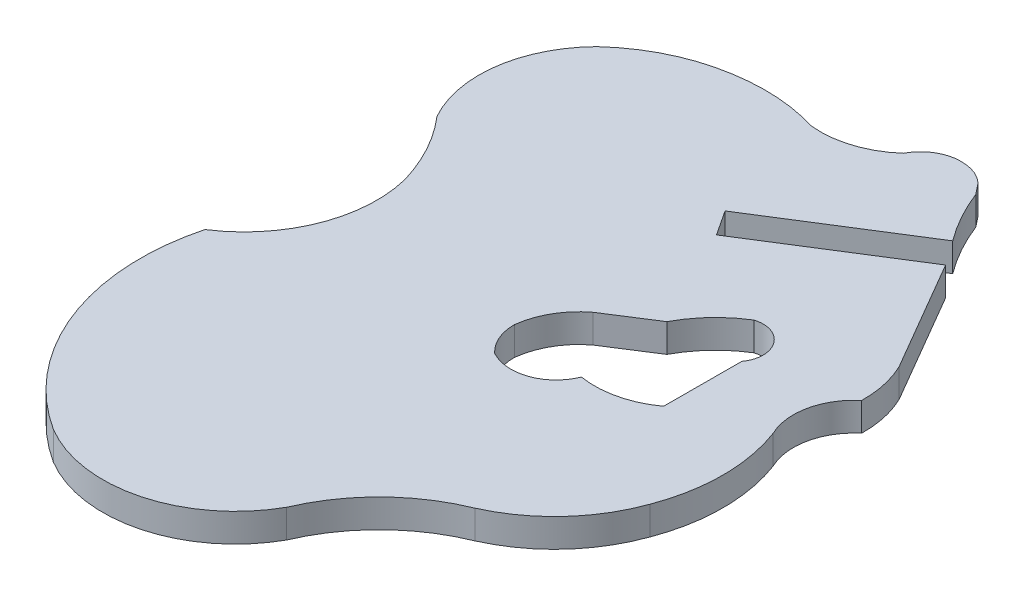
ISO-10303-21;
HEADER;
FILE_DESCRIPTION(('STEP AP214'),'2;1');
FILE_NAME('part.step','',(''),(''),'','','');
FILE_SCHEMA(('AUTOMOTIVE_DESIGN { 1 0 10303 214 1 1 1 1 }'));
ENDSEC;
DATA;
#1=APPLICATION_CONTEXT('core data for automotive mechanical design processes');
#2=APPLICATION_PROTOCOL_DEFINITION('international standard','automotive_design',2000,#1);
#3=PRODUCT_CONTEXT('',#1,'mechanical');
#4=PRODUCT('Part','Part','',(#3));
#5=PRODUCT_RELATED_PRODUCT_CATEGORY('part','',(#4));
#6=PRODUCT_DEFINITION_FORMATION('','',#4);
#7=PRODUCT_DEFINITION_CONTEXT('part definition',#1,'design');
#8=PRODUCT_DEFINITION('design','',#6,#7);
#9=PRODUCT_DEFINITION_SHAPE('','',#8);
#10=(LENGTH_UNIT() NAMED_UNIT(*) SI_UNIT(.MILLI.,.METRE.));
#11=(NAMED_UNIT(*) PLANE_ANGLE_UNIT() SI_UNIT($,.RADIAN.));
#12=(NAMED_UNIT(*) SI_UNIT($,.STERADIAN.) SOLID_ANGLE_UNIT());
#13=UNCERTAINTY_MEASURE_WITH_UNIT(LENGTH_MEASURE(1.E-05),#10,'distance_accuracy_value','');
#14=(GEOMETRIC_REPRESENTATION_CONTEXT(3) GLOBAL_UNCERTAINTY_ASSIGNED_CONTEXT((#13)) GLOBAL_UNIT_ASSIGNED_CONTEXT((#10,
#11,#12)) REPRESENTATION_CONTEXT('',''));
#15=CARTESIAN_POINT('',(0.,0.,0.));
#16=DIRECTION('',(0.,0.,1.));
#17=DIRECTION('',(1.,0.,0.));
#18=AXIS2_PLACEMENT_3D('',#15,#16,#17);
#19=CARTESIAN_POINT('',(-177.073040595718,3.,-146.607961074093));
#20=DIRECTION('',(0.,1.,0.));
#21=DIRECTION('',(0.,0.,1.));
#22=AXIS2_PLACEMENT_3D('',#19,#20,#21);
#23=PLANE('',#22);
#24=CARTESIAN_POINT('',(-177.073040595718,3.,-146.607961074093));
#25=DIRECTION('',(0.,-1.,0.));
#26=DIRECTION('',(0.,0.,1.));
#27=AXIS2_PLACEMENT_3D('',#24,#25,#26);
#28=CIRCLE('',#27,23.2847574819);
#29=CARTESIAN_POINT('',(-195.734879999937,3.,-132.682600000064));
#30=VERTEX_POINT('',#29);
#31=CARTESIAN_POINT('',(-198.767980000004,3.,-138.151629999963));
#32=VERTEX_POINT('',#31);
#33=EDGE_CURVE('E297',#30,#32,#28,.T.);
#34=ORIENTED_EDGE('',*,*,#33,.T.);
#35=DIRECTION('',(-0.620096836389196,0.,-0.784525279070159));
#36=VECTOR('',#35,1.);
#37=CARTESIAN_POINT('',(-199.646109999993,3.,-139.262609999979));
#38=LINE('',#37,#36);
#39=CARTESIAN_POINT('',(-199.646109999993,3.,-139.262609999979));
#40=VERTEX_POINT('',#39);
#41=EDGE_CURVE('E300',#32,#40,#38,.T.);
#42=ORIENTED_EDGE('',*,*,#41,.T.);
#43=CARTESIAN_POINT('',(-202.415735567504,3.,-136.382802406763));
#44=DIRECTION('',(0.,1.,0.));
#45=DIRECTION('',(0.,0.,1.));
#46=AXIS2_PLACEMENT_3D('',#43,#44,#45);
#47=CIRCLE('',#46,3.99551217719999);
#48=CARTESIAN_POINT('',(-202.215419999981,3.,-140.373289999973));
#49=VERTEX_POINT('',#48);
#50=EDGE_CURVE('E303',#40,#49,#47,.T.);
#51=ORIENTED_EDGE('',*,*,#50,.T.);
#52=CARTESIAN_POINT('',(-202.581688652702,3.,-136.164800742078));
#53=DIRECTION('',(0.,1.,0.));
#54=DIRECTION('',(0.,0.,1.));
#55=AXIS2_PLACEMENT_3D('',#52,#53,#54);
#56=CIRCLE('',#55,4.22439753808548);
#57=CARTESIAN_POINT('',(-206.33445,3.,-138.104469999969));
#58=VERTEX_POINT('',#57);
#59=EDGE_CURVE('E305',#49,#58,#56,.T.);
#60=ORIENTED_EDGE('',*,*,#59,.T.);
#61=CARTESIAN_POINT('',(-212.716165418054,3.,-145.258051477838));
#62=DIRECTION('',(0.,-1.,0.));
#63=DIRECTION('',(0.,0.,1.));
#64=AXIS2_PLACEMENT_3D('',#61,#62,#63);
#65=CIRCLE('',#64,9.58644979319999);
#66=CARTESIAN_POINT('',(-213.715389999984,3.,-135.723820000031));
#67=VERTEX_POINT('',#66);
#68=EDGE_CURVE('E307',#58,#67,#65,.T.);
#69=ORIENTED_EDGE('',*,*,#68,.T.);
#70=CARTESIAN_POINT('',(-219.399632120715,3.,-117.047120137484));
#71=DIRECTION('',(0.,1.,0.));
#72=DIRECTION('',(0.,0.,1.));
#73=AXIS2_PLACEMENT_3D('',#70,#71,#72);
#74=CIRCLE('',#73,19.5225440515);
#75=CARTESIAN_POINT('',(-222.625389999992,3.,-136.301320000035));
#76=VERTEX_POINT('',#75);
#77=EDGE_CURVE('E309',#67,#76,#74,.T.);
#78=ORIENTED_EDGE('',*,*,#77,.T.);
#79=CARTESIAN_POINT('',(-219.850682948534,3.,-118.149883391559));
#80=DIRECTION('',(0.,1.,0.));
#81=DIRECTION('',(0.,0.,1.));
#82=AXIS2_PLACEMENT_3D('',#79,#80,#81);
#83=CIRCLE('',#82,18.3622888054);
#84=CARTESIAN_POINT('',(-232.298679999996,3.,-131.648809999986));
#85=VERTEX_POINT('',#84);
#86=EDGE_CURVE('E311',#76,#85,#83,.T.);
#87=ORIENTED_EDGE('',*,*,#86,.T.);
#88=CARTESIAN_POINT('',(-223.186654043018,3.,-122.726242323869));
#89=DIRECTION('',(0.,1.,0.));
#90=DIRECTION('',(0.,0.,1.));
#91=AXIS2_PLACEMENT_3D('',#88,#89,#90);
#92=CIRCLE('',#91,12.7530871155);
#93=CARTESIAN_POINT('',(-235.698870000031,3.,-125.193159999958));
#94=VERTEX_POINT('',#93);
#95=EDGE_CURVE('E313',#85,#94,#92,.T.);
#96=ORIENTED_EDGE('',*,*,#95,.T.);
#97=CARTESIAN_POINT('',(-223.610760955848,3.,-122.848935955944));
#98=DIRECTION('',(0.,1.,0.));
#99=DIRECTION('',(0.,0.,1.));
#100=AXIS2_PLACEMENT_3D('',#97,#98,#99);
#101=CIRCLE('',#100,12.3133166382012);
#102=CARTESIAN_POINT('',(-234.358339999996,3.,-116.840000000021));
#103=VERTEX_POINT('',#102);
#104=EDGE_CURVE('E315',#94,#103,#101,.T.);
#105=ORIENTED_EDGE('',*,*,#104,.T.);
#106=CARTESIAN_POINT('',(-249.626203652665,3.,-103.633186687729));
#107=DIRECTION('',(0.,-1.,0.));
#108=DIRECTION('',(0.,0.,1.));
#109=AXIS2_PLACEMENT_3D('',#106,#107,#108);
#110=CIRCLE('',#109,20.187312312);
#111=CARTESIAN_POINT('',(-230.262679999968,3.,-109.341210000019));
#112=VERTEX_POINT('',#111);
#113=EDGE_CURVE('E317',#103,#112,#110,.T.);
#114=ORIENTED_EDGE('',*,*,#113,.T.);
#115=CARTESIAN_POINT('',(-243.851217543204,3.,-105.987826193848));
#116=DIRECTION('',(0.,-1.,0.));
#117=DIRECTION('',(0.,0.,1.));
#118=AXIS2_PLACEMENT_3D('',#115,#116,#117);
#119=CIRCLE('',#118,13.9961971805);
#120=CARTESIAN_POINT('',(-236.255709999962,3.,-94.2318999999662));
#121=VERTEX_POINT('',#120);
#122=EDGE_CURVE('E319',#112,#121,#119,.T.);
#123=ORIENTED_EDGE('',*,*,#122,.T.);
#124=CARTESIAN_POINT('',(-213.008919949913,3.,-88.1720898716844));
#125=DIRECTION('',(0.,1.,0.));
#126=DIRECTION('',(0.,0.,1.));
#127=AXIS2_PLACEMENT_3D('',#124,#125,#126);
#128=CIRCLE('',#127,24.0236247561);
#129=CARTESIAN_POINT('',(-226.005049999981,3.,-67.9672600000025));
#130=VERTEX_POINT('',#129);
#131=EDGE_CURVE('E321',#121,#130,#128,.T.);
#132=ORIENTED_EDGE('',*,*,#131,.T.);
#133=CARTESIAN_POINT('',(-218.776987319861,3.,-79.9559307137779));
#134=DIRECTION('',(0.,1.,0.));
#135=DIRECTION('',(0.,0.,1.));
#136=AXIS2_PLACEMENT_3D('',#133,#134,#135);
#137=CIRCLE('',#136,13.9990398096116);
#138=CARTESIAN_POINT('',(-206.543770000024,3.,-73.1499399999477));
#139=VERTEX_POINT('',#138);
#140=EDGE_CURVE('E323',#130,#139,#137,.T.);
#141=ORIENTED_EDGE('',*,*,#140,.T.);
#142=CARTESIAN_POINT('',(-189.569126865505,3.,-65.9186332455275));
#143=DIRECTION('',(0.,-1.,0.));
#144=DIRECTION('',(0.,0.,1.));
#145=AXIS2_PLACEMENT_3D('',#142,#143,#144);
#146=CIRCLE('',#145,18.4507535597);
#147=CARTESIAN_POINT('',(-196.522790000002,3.,-83.0088899999687));
#148=VERTEX_POINT('',#147);
#149=EDGE_CURVE('E325',#139,#148,#146,.T.);
#150=ORIENTED_EDGE('',*,*,#149,.T.);
#151=CARTESIAN_POINT('',(-203.328855747617,3.,-98.2206837893));
#152=DIRECTION('',(0.,1.,0.));
#153=DIRECTION('',(0.,0.,1.));
#154=AXIS2_PLACEMENT_3D('',#151,#152,#153);
#155=CIRCLE('',#154,16.6649692844);
#156=CARTESIAN_POINT('',(-187.636320000008,3.,-92.6112699999639));
#157=VERTEX_POINT('',#156);
#158=EDGE_CURVE('E327',#148,#157,#155,.T.);
#159=ORIENTED_EDGE('',*,*,#158,.T.);
#160=CARTESIAN_POINT('',(-204.850439986107,3.,-99.1295587844936));
#161=DIRECTION('',(0.,1.,0.));
#162=DIRECTION('',(0.,0.,1.));
#163=AXIS2_PLACEMENT_3D('',#160,#161,#162);
#164=CIRCLE('',#163,18.4069013028908);
#165=CARTESIAN_POINT('',(-187.615789999981,3.,-105.593370000029));
#166=VERTEX_POINT('',#165);
#167=EDGE_CURVE('E329',#157,#166,#164,.T.);
#168=ORIENTED_EDGE('',*,*,#167,.T.);
#169=CARTESIAN_POINT('',(-181.848418819007,3.,-108.364755441414));
#170=DIRECTION('',(0.,-1.,0.));
#171=DIRECTION('',(0.,0.,1.));
#172=AXIS2_PLACEMENT_3D('',#169,#170,#171);
#173=CIRCLE('',#172,6.39868327110001);
#174=CARTESIAN_POINT('',(-185.947970000007,3.,-113.277679999986));
#175=VERTEX_POINT('',#174);
#176=EDGE_CURVE('E331',#166,#175,#173,.T.);
#177=ORIENTED_EDGE('',*,*,#176,.T.);
#178=CARTESIAN_POINT('',(-197.1378390176,3.,-113.4778555205));
#179=DIRECTION('',(0.,1.,0.));
#180=DIRECTION('',(0.,0.,1.));
#181=AXIS2_PLACEMENT_3D('',#178,#179,#180);
#182=CIRCLE('',#181,11.1916593439);
#183=CARTESIAN_POINT('',(-187.05882000001,3.,-118.342690000003));
#184=VERTEX_POINT('',#183);
#185=EDGE_CURVE('E333',#175,#184,#182,.T.);
#186=ORIENTED_EDGE('',*,*,#185,.T.);
#187=DIRECTION('',(-0.50306954793614,0.,-0.86424593139877));
#188=VECTOR('',#187,1.);
#189=CARTESIAN_POINT('',(-193.90008,3.,-130.0956));
#190=LINE('',#189,#188);
#191=CARTESIAN_POINT('',(-193.90008,3.,-130.0956));
#192=VERTEX_POINT('',#191);
#193=EDGE_CURVE('E335',#184,#192,#190,.T.);
#194=ORIENTED_EDGE('',*,*,#193,.T.);
#195=DIRECTION('',(-0.846419801881814,0.,0.532516214760031));
#196=VECTOR('',#195,1.);
#197=CARTESIAN_POINT('',(-208.75176,3.,-120.75182));
#198=LINE('',#197,#196);
#199=CARTESIAN_POINT('',(-208.75176,3.,-120.75182));
#200=VERTEX_POINT('',#199);
#201=EDGE_CURVE('E337',#192,#200,#198,.T.);
#202=ORIENTED_EDGE('',*,*,#201,.T.);
#203=DIRECTION('',(-0.549969731069871,0.,-0.83518458732602));
#204=VECTOR('',#203,1.);
#205=CARTESIAN_POINT('',(-210.49387,3.,-123.39739));
#206=LINE('',#205,#204);
#207=CARTESIAN_POINT('',(-210.49387,3.,-123.39739));
#208=VERTEX_POINT('',#207);
#209=EDGE_CURVE('E339',#200,#208,#206,.T.);
#210=ORIENTED_EDGE('',*,*,#209,.T.);
#211=DIRECTION('',(0.846426394731718,0.,-0.532505735463447));
#212=VECTOR('',#211,1.);
#213=CARTESIAN_POINT('',(-195.734879999937,3.,-132.682600000064));
#214=LINE('',#213,#212);
#215=EDGE_CURVE('E341',#208,#30,#214,.T.);
#216=ORIENTED_EDGE('',*,*,#215,.T.);
#217=EDGE_LOOP('',(#34,#42,#51,#60,#69,#78,#87,#96,#105,#114,#123,#132,#141,#150,#159,#168,#177,
#186,#194,#202,#210,#216));
#218=FACE_BOUND('',#217,.T.);
#219=CARTESIAN_POINT('',(-207.324159857303,3.,-102.387960050793));
#220=DIRECTION('',(0.,1.,0.));
#221=DIRECTION('',(0.,0.,1.));
#222=AXIS2_PLACEMENT_3D('',#219,#220,#221);
#223=CIRCLE('',#222,4.7764110298);
#224=CARTESIAN_POINT('',(-209.643420000052,3.,-98.2124199999914));
#225=VERTEX_POINT('',#224);
#226=CARTESIAN_POINT('',(-202.887099999982,3.,-100.619739999965));
#227=VERTEX_POINT('',#226);
#228=EDGE_CURVE('E240',#225,#227,#223,.T.);
#229=ORIENTED_EDGE('',*,*,#228,.F.);
#230=CARTESIAN_POINT('',(-206.279949198406,3.,-101.826418136906));
#231=DIRECTION('',(0.,1.,0.));
#232=DIRECTION('',(0.,0.,1.));
#233=AXIS2_PLACEMENT_3D('',#230,#231,#232);
#234=CIRCLE('',#233,4.93699487209999);
#235=CARTESIAN_POINT('',(-211.216760000067,3.,-101.869049999994));
#236=VERTEX_POINT('',#235);
#237=EDGE_CURVE('E232',#236,#225,#234,.T.);
#238=ORIENTED_EDGE('',*,*,#237,.F.);
#239=CARTESIAN_POINT('',(-203.512905561007,3.,-100.976537756439));
#240=DIRECTION('',(0.,1.,0.));
#241=DIRECTION('',(0.,0.,1.));
#242=AXIS2_PLACEMENT_3D('',#239,#240,#241);
#243=CIRCLE('',#242,7.75538208750001);
#244=CARTESIAN_POINT('',(-208.18492,3.,-107.16671));
#245=VERTEX_POINT('',#244);
#246=EDGE_CURVE('E265',#245,#236,#243,.T.);
#247=ORIENTED_EDGE('',*,*,#246,.F.);
#248=DIRECTION('',(-0.842609819054227,0.,0.538524551746159));
#249=VECTOR('',#248,1.);
#250=CARTESIAN_POINT('',(-203.441110000026,3.,-110.198550000004));
#251=LINE('',#250,#249);
#252=CARTESIAN_POINT('',(-203.441110000026,3.,-110.198550000004));
#253=VERTEX_POINT('',#252);
#254=EDGE_CURVE('E263',#253,#245,#251,.T.);
#255=ORIENTED_EDGE('',*,*,#254,.F.);
#256=CARTESIAN_POINT('',(-192.432284118591,3.,-104.344365599818));
#257=DIRECTION('',(0.,1.,0.));
#258=DIRECTION('',(0.,0.,1.));
#259=AXIS2_PLACEMENT_3D('',#256,#257,#258);
#260=CIRCLE('',#259,12.4685894262);
#261=CARTESIAN_POINT('',(-199.000790000004,3.,-114.942500000031));
#262=VERTEX_POINT('',#261);
#263=EDGE_CURVE('E261',#262,#253,#260,.T.);
#264=ORIENTED_EDGE('',*,*,#263,.F.);
#265=CARTESIAN_POINT('',(-198.152149598475,3.,-112.215069436477));
#266=DIRECTION('',(0.,1.,0.));
#267=DIRECTION('',(0.,0.,1.));
#268=AXIS2_PLACEMENT_3D('',#265,#266,#267);
#269=CIRCLE('',#268,2.85640823590001);
#270=CARTESIAN_POINT('',(-195.85097,3.,-110.52284));
#271=VERTEX_POINT('',#270);
#272=EDGE_CURVE('E259',#271,#262,#269,.T.);
#273=ORIENTED_EDGE('',*,*,#272,.F.);
#274=DIRECTION('',(0.00286829144360486,0.,-0.999995886443637));
#275=VECTOR('',#274,1.);
#276=CARTESIAN_POINT('',(-195.874599999969,3.,-102.284520000027));
#277=LINE('',#276,#275);
#278=CARTESIAN_POINT('',(-195.874599999969,3.,-102.284520000027));
#279=VERTEX_POINT('',#278);
#280=EDGE_CURVE('E255',#279,#271,#277,.T.);
#281=ORIENTED_EDGE('',*,*,#280,.F.);
#282=CARTESIAN_POINT('',(-201.38211636918,3.,-109.882000861942));
#283=DIRECTION('',(0.,1.,0.));
#284=DIRECTION('',(0.,0.,1.));
#285=AXIS2_PLACEMENT_3D('',#282,#283,#284);
#286=CIRCLE('',#285,9.38373337239998);
#287=EDGE_CURVE('E253',#227,#279,#286,.T.);
#288=ORIENTED_EDGE('',*,*,#287,.F.);
#289=EDGE_LOOP('',(#229,#238,#247,#255,#264,#273,#281,#288));
#290=FACE_BOUND('',#289,.T.);
#291=ADVANCED_FACE('F35',(#218,#290),#23,.T.);
#292=CARTESIAN_POINT('',(-177.073040595718,0.,-146.607961074093));
#293=DIRECTION('',(0.,1.,0.));
#294=DIRECTION('',(0.,0.,1.));
#295=AXIS2_PLACEMENT_3D('',#292,#293,#294);
#296=PLANE('',#295);
#297=CARTESIAN_POINT('',(-177.073040595718,0.,-146.607961074093));
#298=DIRECTION('',(0.,-1.,0.));
#299=DIRECTION('',(0.,0.,1.));
#300=AXIS2_PLACEMENT_3D('',#297,#298,#299);
#301=CIRCLE('',#300,23.2847574819);
#302=CARTESIAN_POINT('',(-195.734879999937,0.,-132.682600000064));
#303=VERTEX_POINT('',#302);
#304=CARTESIAN_POINT('',(-198.767980000004,0.,-138.151629999963));
#305=VERTEX_POINT('',#304);
#306=EDGE_CURVE('E248',#303,#305,#301,.T.);
#307=ORIENTED_EDGE('',*,*,#306,.F.);
#308=DIRECTION('',(0.846426394731718,0.,-0.532505735463447));
#309=VECTOR('',#308,1.);
#310=CARTESIAN_POINT('',(-195.734879999937,0.,-132.682600000064));
#311=LINE('',#310,#309);
#312=CARTESIAN_POINT('',(-210.49387,0.,-123.39739));
#313=VERTEX_POINT('',#312);
#314=EDGE_CURVE('E301',#313,#303,#311,.T.);
#315=ORIENTED_EDGE('',*,*,#314,.F.);
#316=DIRECTION('',(-0.549969731069871,0.,-0.83518458732602));
#317=VECTOR('',#316,1.);
#318=CARTESIAN_POINT('',(-210.49387,0.,-123.39739));
#319=LINE('',#318,#317);
#320=CARTESIAN_POINT('',(-208.75176,0.,-120.75182));
#321=VERTEX_POINT('',#320);
#322=EDGE_CURVE('E384',#321,#313,#319,.T.);
#323=ORIENTED_EDGE('',*,*,#322,.F.);
#324=DIRECTION('',(-0.846419801881814,0.,0.532516214760031));
#325=VECTOR('',#324,1.);
#326=CARTESIAN_POINT('',(-208.75176,0.,-120.75182));
#327=LINE('',#326,#325);
#328=CARTESIAN_POINT('',(-193.90008,0.,-130.0956));
#329=VERTEX_POINT('',#328);
#330=EDGE_CURVE('E382',#329,#321,#327,.T.);
#331=ORIENTED_EDGE('',*,*,#330,.F.);
#332=DIRECTION('',(-0.50306954793614,0.,-0.86424593139877));
#333=VECTOR('',#332,1.);
#334=CARTESIAN_POINT('',(-193.90008,0.,-130.0956));
#335=LINE('',#334,#333);
#336=CARTESIAN_POINT('',(-187.05882000001,0.,-118.342690000003));
#337=VERTEX_POINT('',#336);
#338=EDGE_CURVE('E380',#337,#329,#335,.T.);
#339=ORIENTED_EDGE('',*,*,#338,.F.);
#340=CARTESIAN_POINT('',(-197.1378390176,0.,-113.4778555205));
#341=DIRECTION('',(0.,1.,0.));
#342=DIRECTION('',(0.,0.,1.));
#343=AXIS2_PLACEMENT_3D('',#340,#341,#342);
#344=CIRCLE('',#343,11.1916593439);
#345=CARTESIAN_POINT('',(-185.947970000007,0.,-113.277679999986));
#346=VERTEX_POINT('',#345);
#347=EDGE_CURVE('E378',#346,#337,#344,.T.);
#348=ORIENTED_EDGE('',*,*,#347,.F.);
#349=CARTESIAN_POINT('',(-181.848418819007,0.,-108.364755441414));
#350=DIRECTION('',(0.,-1.,0.));
#351=DIRECTION('',(0.,0.,1.));
#352=AXIS2_PLACEMENT_3D('',#349,#350,#351);
#353=CIRCLE('',#352,6.39868327110001);
#354=CARTESIAN_POINT('',(-187.615789999981,0.,-105.593370000029));
#355=VERTEX_POINT('',#354);
#356=EDGE_CURVE('E376',#355,#346,#353,.T.);
#357=ORIENTED_EDGE('',*,*,#356,.F.);
#358=CARTESIAN_POINT('',(-204.850439986107,0.,-99.1295587844936));
#359=DIRECTION('',(0.,1.,0.));
#360=DIRECTION('',(0.,0.,1.));
#361=AXIS2_PLACEMENT_3D('',#358,#359,#360);
#362=CIRCLE('',#361,18.4069013028908);
#363=CARTESIAN_POINT('',(-187.636320000008,0.,-92.6112699999639));
#364=VERTEX_POINT('',#363);
#365=EDGE_CURVE('E374',#364,#355,#362,.T.);
#366=ORIENTED_EDGE('',*,*,#365,.F.);
#367=CARTESIAN_POINT('',(-203.328855747617,0.,-98.2206837893));
#368=DIRECTION('',(0.,1.,0.));
#369=DIRECTION('',(0.,0.,1.));
#370=AXIS2_PLACEMENT_3D('',#367,#368,#369);
#371=CIRCLE('',#370,16.6649692844);
#372=CARTESIAN_POINT('',(-196.522790000002,0.,-83.0088899999687));
#373=VERTEX_POINT('',#372);
#374=EDGE_CURVE('E372',#373,#364,#371,.T.);
#375=ORIENTED_EDGE('',*,*,#374,.F.);
#376=CARTESIAN_POINT('',(-189.569126865505,0.,-65.9186332455275));
#377=DIRECTION('',(0.,-1.,0.));
#378=DIRECTION('',(0.,0.,1.));
#379=AXIS2_PLACEMENT_3D('',#376,#377,#378);
#380=CIRCLE('',#379,18.4507535597);
#381=CARTESIAN_POINT('',(-206.543770000024,0.,-73.1499399999477));
#382=VERTEX_POINT('',#381);
#383=EDGE_CURVE('E370',#382,#373,#380,.T.);
#384=ORIENTED_EDGE('',*,*,#383,.F.);
#385=CARTESIAN_POINT('',(-218.776987319861,0.,-79.9559307137779));
#386=DIRECTION('',(0.,1.,0.));
#387=DIRECTION('',(0.,0.,1.));
#388=AXIS2_PLACEMENT_3D('',#385,#386,#387);
#389=CIRCLE('',#388,13.9990398096116);
#390=CARTESIAN_POINT('',(-226.005049999981,0.,-67.9672600000025));
#391=VERTEX_POINT('',#390);
#392=EDGE_CURVE('E368',#391,#382,#389,.T.);
#393=ORIENTED_EDGE('',*,*,#392,.F.);
#394=CARTESIAN_POINT('',(-213.008919949913,0.,-88.1720898716844));
#395=DIRECTION('',(0.,1.,0.));
#396=DIRECTION('',(0.,0.,1.));
#397=AXIS2_PLACEMENT_3D('',#394,#395,#396);
#398=CIRCLE('',#397,24.0236247561);
#399=CARTESIAN_POINT('',(-236.255709999962,0.,-94.2318999999662));
#400=VERTEX_POINT('',#399);
#401=EDGE_CURVE('E366',#400,#391,#398,.T.);
#402=ORIENTED_EDGE('',*,*,#401,.F.);
#403=CARTESIAN_POINT('',(-243.851217543204,0.,-105.987826193848));
#404=DIRECTION('',(0.,-1.,0.));
#405=DIRECTION('',(0.,0.,1.));
#406=AXIS2_PLACEMENT_3D('',#403,#404,#405);
#407=CIRCLE('',#406,13.9961971805);
#408=CARTESIAN_POINT('',(-230.262679999968,0.,-109.341210000019));
#409=VERTEX_POINT('',#408);
#410=EDGE_CURVE('E364',#409,#400,#407,.T.);
#411=ORIENTED_EDGE('',*,*,#410,.F.);
#412=CARTESIAN_POINT('',(-249.626203652665,0.,-103.633186687729));
#413=DIRECTION('',(0.,-1.,0.));
#414=DIRECTION('',(0.,0.,1.));
#415=AXIS2_PLACEMENT_3D('',#412,#413,#414);
#416=CIRCLE('',#415,20.187312312);
#417=CARTESIAN_POINT('',(-234.358339999996,0.,-116.840000000021));
#418=VERTEX_POINT('',#417);
#419=EDGE_CURVE('E362',#418,#409,#416,.T.);
#420=ORIENTED_EDGE('',*,*,#419,.F.);
#421=CARTESIAN_POINT('',(-223.610760955848,0.,-122.848935955944));
#422=DIRECTION('',(0.,1.,0.));
#423=DIRECTION('',(0.,0.,1.));
#424=AXIS2_PLACEMENT_3D('',#421,#422,#423);
#425=CIRCLE('',#424,12.3133166382012);
#426=CARTESIAN_POINT('',(-235.698870000031,0.,-125.193159999958));
#427=VERTEX_POINT('',#426);
#428=EDGE_CURVE('E360',#427,#418,#425,.T.);
#429=ORIENTED_EDGE('',*,*,#428,.F.);
#430=CARTESIAN_POINT('',(-223.186654043018,0.,-122.726242323869));
#431=DIRECTION('',(0.,1.,0.));
#432=DIRECTION('',(0.,0.,1.));
#433=AXIS2_PLACEMENT_3D('',#430,#431,#432);
#434=CIRCLE('',#433,12.7530871155);
#435=CARTESIAN_POINT('',(-232.298679999996,0.,-131.648809999986));
#436=VERTEX_POINT('',#435);
#437=EDGE_CURVE('E358',#436,#427,#434,.T.);
#438=ORIENTED_EDGE('',*,*,#437,.F.);
#439=CARTESIAN_POINT('',(-219.850682948534,0.,-118.149883391559));
#440=DIRECTION('',(0.,1.,0.));
#441=DIRECTION('',(0.,0.,1.));
#442=AXIS2_PLACEMENT_3D('',#439,#440,#441);
#443=CIRCLE('',#442,18.3622888054);
#444=CARTESIAN_POINT('',(-222.625389999992,0.,-136.301320000035));
#445=VERTEX_POINT('',#444);
#446=EDGE_CURVE('E356',#445,#436,#443,.T.);
#447=ORIENTED_EDGE('',*,*,#446,.F.);
#448=CARTESIAN_POINT('',(-219.399632120715,0.,-117.047120137484));
#449=DIRECTION('',(0.,1.,0.));
#450=DIRECTION('',(0.,0.,1.));
#451=AXIS2_PLACEMENT_3D('',#448,#449,#450);
#452=CIRCLE('',#451,19.5225440515);
#453=CARTESIAN_POINT('',(-213.715389999984,0.,-135.723820000031));
#454=VERTEX_POINT('',#453);
#455=EDGE_CURVE('E354',#454,#445,#452,.T.);
#456=ORIENTED_EDGE('',*,*,#455,.F.);
#457=CARTESIAN_POINT('',(-212.716165418054,0.,-145.258051477838));
#458=DIRECTION('',(0.,-1.,0.));
#459=DIRECTION('',(0.,0.,1.));
#460=AXIS2_PLACEMENT_3D('',#457,#458,#459);
#461=CIRCLE('',#460,9.58644979319999);
#462=CARTESIAN_POINT('',(-206.33445,0.,-138.104469999969));
#463=VERTEX_POINT('',#462);
#464=EDGE_CURVE('E352',#463,#454,#461,.T.);
#465=ORIENTED_EDGE('',*,*,#464,.F.);
#466=CARTESIAN_POINT('',(-202.581688652702,0.,-136.164800742078));
#467=DIRECTION('',(0.,1.,0.));
#468=DIRECTION('',(0.,0.,1.));
#469=AXIS2_PLACEMENT_3D('',#466,#467,#468);
#470=CIRCLE('',#469,4.22439753808548);
#471=CARTESIAN_POINT('',(-202.215419999981,0.,-140.373289999973));
#472=VERTEX_POINT('',#471);
#473=EDGE_CURVE('E350',#472,#463,#470,.T.);
#474=ORIENTED_EDGE('',*,*,#473,.F.);
#475=CARTESIAN_POINT('',(-202.415735567504,0.,-136.382802406763));
#476=DIRECTION('',(0.,1.,0.));
#477=DIRECTION('',(0.,0.,1.));
#478=AXIS2_PLACEMENT_3D('',#475,#476,#477);
#479=CIRCLE('',#478,3.99551217719999);
#480=CARTESIAN_POINT('',(-199.646109999993,0.,-139.262609999979));
#481=VERTEX_POINT('',#480);
#482=EDGE_CURVE('E348',#481,#472,#479,.T.);
#483=ORIENTED_EDGE('',*,*,#482,.F.);
#484=DIRECTION('',(-0.620096836389196,0.,-0.784525279070159));
#485=VECTOR('',#484,1.);
#486=CARTESIAN_POINT('',(-199.646109999993,0.,-139.262609999979));
#487=LINE('',#486,#485);
#488=EDGE_CURVE('E346',#305,#481,#487,.T.);
#489=ORIENTED_EDGE('',*,*,#488,.F.);
#490=EDGE_LOOP('',(#307,#315,#323,#331,#339,#348,#357,#366,#375,#384,#393,#402,#411,#420,#429,
#438,#447,#456,#465,#474,#483,#489));
#491=FACE_BOUND('',#490,.T.);
#492=CARTESIAN_POINT('',(-206.279949198406,0.,-101.826418136906));
#493=DIRECTION('',(0.,1.,0.));
#494=DIRECTION('',(0.,0.,1.));
#495=AXIS2_PLACEMENT_3D('',#492,#493,#494);
#496=CIRCLE('',#495,4.93699487209999);
#497=CARTESIAN_POINT('',(-211.216760000067,0.,-101.869049999994));
#498=VERTEX_POINT('',#497);
#499=CARTESIAN_POINT('',(-209.643420000052,0.,-98.2124199999914));
#500=VERTEX_POINT('',#499);
#501=EDGE_CURVE('E58',#498,#500,#496,.T.);
#502=ORIENTED_EDGE('',*,*,#501,.T.);
#503=CARTESIAN_POINT('',(-207.324159857303,0.,-102.387960050793));
#504=DIRECTION('',(0.,1.,0.));
#505=DIRECTION('',(0.,0.,1.));
#506=AXIS2_PLACEMENT_3D('',#503,#504,#505);
#507=CIRCLE('',#506,4.7764110298);
#508=CARTESIAN_POINT('',(-202.887099999982,0.,-100.619739999965));
#509=VERTEX_POINT('',#508);
#510=EDGE_CURVE('E247',#500,#509,#507,.T.);
#511=ORIENTED_EDGE('',*,*,#510,.T.);
#512=CARTESIAN_POINT('',(-201.38211636918,0.,-109.882000861942));
#513=DIRECTION('',(0.,1.,0.));
#514=DIRECTION('',(0.,0.,1.));
#515=AXIS2_PLACEMENT_3D('',#512,#513,#514);
#516=CIRCLE('',#515,9.38373337239998);
#517=CARTESIAN_POINT('',(-195.874599999969,0.,-102.284520000027));
#518=VERTEX_POINT('',#517);
#519=EDGE_CURVE('E269',#509,#518,#516,.T.);
#520=ORIENTED_EDGE('',*,*,#519,.T.);
#521=DIRECTION('',(0.00286829144360486,0.,-0.999995886443637));
#522=VECTOR('',#521,1.);
#523=CARTESIAN_POINT('',(-195.874599999969,0.,-102.284520000027));
#524=LINE('',#523,#522);
#525=CARTESIAN_POINT('',(-195.85097,0.,-110.52284));
#526=VERTEX_POINT('',#525);
#527=EDGE_CURVE('E272',#518,#526,#524,.T.);
#528=ORIENTED_EDGE('',*,*,#527,.T.);
#529=CARTESIAN_POINT('',(-198.152149598475,0.,-112.215069436477));
#530=DIRECTION('',(0.,1.,0.));
#531=DIRECTION('',(0.,0.,1.));
#532=AXIS2_PLACEMENT_3D('',#529,#530,#531);
#533=CIRCLE('',#532,2.85640823590001);
#534=CARTESIAN_POINT('',(-199.000790000004,0.,-114.942500000031));
#535=VERTEX_POINT('',#534);
#536=EDGE_CURVE('E275',#526,#535,#533,.T.);
#537=ORIENTED_EDGE('',*,*,#536,.T.);
#538=CARTESIAN_POINT('',(-192.432284118591,0.,-104.344365599818));
#539=DIRECTION('',(0.,1.,0.));
#540=DIRECTION('',(0.,0.,1.));
#541=AXIS2_PLACEMENT_3D('',#538,#539,#540);
#542=CIRCLE('',#541,12.4685894262);
#543=CARTESIAN_POINT('',(-203.441110000026,0.,-110.198550000004));
#544=VERTEX_POINT('',#543);
#545=EDGE_CURVE('E278',#535,#544,#542,.T.);
#546=ORIENTED_EDGE('',*,*,#545,.T.);
#547=DIRECTION('',(-0.842609819054227,0.,0.538524551746159));
#548=VECTOR('',#547,1.);
#549=CARTESIAN_POINT('',(-203.441110000026,0.,-110.198550000004));
#550=LINE('',#549,#548);
#551=CARTESIAN_POINT('',(-208.18492,0.,-107.16671));
#552=VERTEX_POINT('',#551);
#553=EDGE_CURVE('E281',#544,#552,#550,.T.);
#554=ORIENTED_EDGE('',*,*,#553,.T.);
#555=CARTESIAN_POINT('',(-203.512905561007,0.,-100.976537756439));
#556=DIRECTION('',(0.,1.,0.));
#557=DIRECTION('',(0.,0.,1.));
#558=AXIS2_PLACEMENT_3D('',#555,#556,#557);
#559=CIRCLE('',#558,7.75538208750001);
#560=EDGE_CURVE('E241',#552,#498,#559,.T.);
#561=ORIENTED_EDGE('',*,*,#560,.T.);
#562=EDGE_LOOP('',(#502,#511,#520,#528,#537,#546,#554,#561));
#563=FACE_BOUND('',#562,.T.);
#564=ADVANCED_FACE('F456',(#491,#563),#296,.F.);
#565=CARTESIAN_POINT('',(-177.073040595718,3.,-146.607961074093));
#566=DIRECTION('',(0.,-1.,0.));
#567=DIRECTION('',(0.,0.,-1.));
#568=AXIS2_PLACEMENT_3D('',#565,#566,#567);
#569=CYLINDRICAL_SURFACE('',#568,23.2847574819);
#570=ORIENTED_EDGE('',*,*,#306,.T.);
#571=DIRECTION('',(0.,-1.,0.));
#572=VECTOR('',#571,1.);
#573=CARTESIAN_POINT('',(-198.767980000004,3.,-138.151629999963));
#574=LINE('',#573,#572);
#575=EDGE_CURVE('E11',#32,#305,#574,.T.);
#576=ORIENTED_EDGE('',*,*,#575,.F.);
#577=ORIENTED_EDGE('',*,*,#33,.F.);
#578=DIRECTION('',(0.,-1.,0.));
#579=VECTOR('',#578,1.);
#580=CARTESIAN_POINT('',(-195.734879999937,3.,-132.682600000064));
#581=LINE('',#580,#579);
#582=EDGE_CURVE('E343',#30,#303,#581,.T.);
#583=ORIENTED_EDGE('',*,*,#582,.T.);
#584=EDGE_LOOP('',(#570,#576,#577,#583));
#585=FACE_BOUND('',#584,.T.);
#586=ADVANCED_FACE('F37',(#585),#569,.F.);
#587=CARTESIAN_POINT('',(-199.646109999993,3.,-139.262609999979));
#588=DIRECTION('',(-0.784525279070159,0.,0.620096836389196));
#589=DIRECTION('',(0.620096836389196,0.,0.784525279070159));
#590=AXIS2_PLACEMENT_3D('',#587,#588,#589);
#591=PLANE('',#590);
#592=ORIENTED_EDGE('',*,*,#488,.T.);
#593=DIRECTION('',(0.,-1.,0.));
#594=VECTOR('',#593,1.);
#595=CARTESIAN_POINT('',(-199.646109999993,3.,-139.262609999979));
#596=LINE('',#595,#594);
#597=EDGE_CURVE('E43',#40,#481,#596,.T.);
#598=ORIENTED_EDGE('',*,*,#597,.F.);
#599=ORIENTED_EDGE('',*,*,#41,.F.);
#600=ORIENTED_EDGE('',*,*,#575,.T.);
#601=EDGE_LOOP('',(#592,#598,#599,#600));
#602=FACE_BOUND('',#601,.T.);
#603=ADVANCED_FACE('F473',(#602),#591,.F.);
#604=CARTESIAN_POINT('',(-202.415735567504,3.,-136.382802406763));
#605=DIRECTION('',(0.,-1.,0.));
#606=DIRECTION('',(0.,0.,-1.));
#607=AXIS2_PLACEMENT_3D('',#604,#605,#606);
#608=CYLINDRICAL_SURFACE('',#607,3.99551217719999);
#609=ORIENTED_EDGE('',*,*,#482,.T.);
#610=DIRECTION('',(0.,-1.,0.));
#611=VECTOR('',#610,1.);
#612=CARTESIAN_POINT('',(-202.215419999981,3.,-140.373289999973));
#613=LINE('',#612,#611);
#614=EDGE_CURVE('E443',#49,#472,#613,.T.);
#615=ORIENTED_EDGE('',*,*,#614,.F.);
#616=ORIENTED_EDGE('',*,*,#50,.F.);
#617=ORIENTED_EDGE('',*,*,#597,.T.);
#618=EDGE_LOOP('',(#609,#615,#616,#617));
#619=FACE_BOUND('',#618,.T.);
#620=ADVANCED_FACE('F450',(#619),#608,.T.);
#621=CARTESIAN_POINT('',(-202.581688652702,3.,-136.164800742078));
#622=DIRECTION('',(0.,-1.,0.));
#623=DIRECTION('',(0.,0.,-1.));
#624=AXIS2_PLACEMENT_3D('',#621,#622,#623);
#625=CYLINDRICAL_SURFACE('',#624,4.22439753808548);
#626=ORIENTED_EDGE('',*,*,#473,.T.);
#627=DIRECTION('',(0.,-1.,0.));
#628=VECTOR('',#627,1.);
#629=CARTESIAN_POINT('',(-206.33445,3.,-138.104469999969));
#630=LINE('',#629,#628);
#631=EDGE_CURVE('E440',#58,#463,#630,.T.);
#632=ORIENTED_EDGE('',*,*,#631,.F.);
#633=ORIENTED_EDGE('',*,*,#59,.F.);
#634=ORIENTED_EDGE('',*,*,#614,.T.);
#635=EDGE_LOOP('',(#626,#632,#633,#634));
#636=FACE_BOUND('',#635,.T.);
#637=ADVANCED_FACE('F462',(#636),#625,.T.);
#638=CARTESIAN_POINT('',(-212.716165418054,3.,-145.258051477838));
#639=DIRECTION('',(0.,-1.,0.));
#640=DIRECTION('',(0.,0.,-1.));
#641=AXIS2_PLACEMENT_3D('',#638,#639,#640);
#642=CYLINDRICAL_SURFACE('',#641,9.58644979319999);
#643=ORIENTED_EDGE('',*,*,#464,.T.);
#644=DIRECTION('',(0.,-1.,0.));
#645=VECTOR('',#644,1.);
#646=CARTESIAN_POINT('',(-213.715389999984,3.,-135.723820000031));
#647=LINE('',#646,#645);
#648=EDGE_CURVE('E437',#67,#454,#647,.T.);
#649=ORIENTED_EDGE('',*,*,#648,.F.);
#650=ORIENTED_EDGE('',*,*,#68,.F.);
#651=ORIENTED_EDGE('',*,*,#631,.T.);
#652=EDGE_LOOP('',(#643,#649,#650,#651));
#653=FACE_BOUND('',#652,.T.);
#654=ADVANCED_FACE('F466',(#653),#642,.F.);
#655=CARTESIAN_POINT('',(-219.399632120715,3.,-117.047120137484));
#656=DIRECTION('',(0.,-1.,0.));
#657=DIRECTION('',(0.,0.,-1.));
#658=AXIS2_PLACEMENT_3D('',#655,#656,#657);
#659=CYLINDRICAL_SURFACE('',#658,19.5225440515);
#660=ORIENTED_EDGE('',*,*,#455,.T.);
#661=DIRECTION('',(0.,-1.,0.));
#662=VECTOR('',#661,1.);
#663=CARTESIAN_POINT('',(-222.625389999992,3.,-136.301320000035));
#664=LINE('',#663,#662);
#665=EDGE_CURVE('E434',#76,#445,#664,.T.);
#666=ORIENTED_EDGE('',*,*,#665,.F.);
#667=ORIENTED_EDGE('',*,*,#77,.F.);
#668=ORIENTED_EDGE('',*,*,#648,.T.);
#669=EDGE_LOOP('',(#660,#666,#667,#668));
#670=FACE_BOUND('',#669,.T.);
#671=ADVANCED_FACE('F556',(#670),#659,.T.);
#672=CARTESIAN_POINT('',(-219.850682948534,3.,-118.149883391559));
#673=DIRECTION('',(0.,-1.,0.));
#674=DIRECTION('',(0.,0.,-1.));
#675=AXIS2_PLACEMENT_3D('',#672,#673,#674);
#676=CYLINDRICAL_SURFACE('',#675,18.3622888054);
#677=ORIENTED_EDGE('',*,*,#446,.T.);
#678=DIRECTION('',(0.,-1.,0.));
#679=VECTOR('',#678,1.);
#680=CARTESIAN_POINT('',(-232.298679999996,3.,-131.648809999986));
#681=LINE('',#680,#679);
#682=EDGE_CURVE('E431',#85,#436,#681,.T.);
#683=ORIENTED_EDGE('',*,*,#682,.F.);
#684=ORIENTED_EDGE('',*,*,#86,.F.);
#685=ORIENTED_EDGE('',*,*,#665,.T.);
#686=EDGE_LOOP('',(#677,#683,#684,#685));
#687=FACE_BOUND('',#686,.T.);
#688=ADVANCED_FACE('F553',(#687),#676,.T.);
#689=CARTESIAN_POINT('',(-223.186654043018,3.,-122.726242323869));
#690=DIRECTION('',(0.,-1.,0.));
#691=DIRECTION('',(0.,0.,-1.));
#692=AXIS2_PLACEMENT_3D('',#689,#690,#691);
#693=CYLINDRICAL_SURFACE('',#692,12.7530871155);
#694=ORIENTED_EDGE('',*,*,#437,.T.);
#695=DIRECTION('',(0.,-1.,0.));
#696=VECTOR('',#695,1.);
#697=CARTESIAN_POINT('',(-235.698870000031,3.,-125.193159999958));
#698=LINE('',#697,#696);
#699=EDGE_CURVE('E428',#94,#427,#698,.T.);
#700=ORIENTED_EDGE('',*,*,#699,.F.);
#701=ORIENTED_EDGE('',*,*,#95,.F.);
#702=ORIENTED_EDGE('',*,*,#682,.T.);
#703=EDGE_LOOP('',(#694,#700,#701,#702));
#704=FACE_BOUND('',#703,.T.);
#705=ADVANCED_FACE('F549',(#704),#693,.T.);
#706=CARTESIAN_POINT('',(-223.610760955848,3.,-122.848935955944));
#707=DIRECTION('',(0.,-1.,0.));
#708=DIRECTION('',(0.,0.,-1.));
#709=AXIS2_PLACEMENT_3D('',#706,#707,#708);
#710=CYLINDRICAL_SURFACE('',#709,12.3133166382012);
#711=ORIENTED_EDGE('',*,*,#428,.T.);
#712=DIRECTION('',(0.,-1.,0.));
#713=VECTOR('',#712,1.);
#714=CARTESIAN_POINT('',(-234.358339999996,3.,-116.840000000021));
#715=LINE('',#714,#713);
#716=EDGE_CURVE('E425',#103,#418,#715,.T.);
#717=ORIENTED_EDGE('',*,*,#716,.F.);
#718=ORIENTED_EDGE('',*,*,#104,.F.);
#719=ORIENTED_EDGE('',*,*,#699,.T.);
#720=EDGE_LOOP('',(#711,#717,#718,#719));
#721=FACE_BOUND('',#720,.T.);
#722=ADVANCED_FACE('F545',(#721),#710,.T.);
#723=CARTESIAN_POINT('',(-249.626203652665,3.,-103.633186687729));
#724=DIRECTION('',(0.,-1.,0.));
#725=DIRECTION('',(0.,0.,-1.));
#726=AXIS2_PLACEMENT_3D('',#723,#724,#725);
#727=CYLINDRICAL_SURFACE('',#726,20.187312312);
#728=ORIENTED_EDGE('',*,*,#419,.T.);
#729=DIRECTION('',(0.,-1.,0.));
#730=VECTOR('',#729,1.);
#731=CARTESIAN_POINT('',(-230.262679999968,3.,-109.341210000019));
#732=LINE('',#731,#730);
#733=EDGE_CURVE('E422',#112,#409,#732,.T.);
#734=ORIENTED_EDGE('',*,*,#733,.F.);
#735=ORIENTED_EDGE('',*,*,#113,.F.);
#736=ORIENTED_EDGE('',*,*,#716,.T.);
#737=EDGE_LOOP('',(#728,#734,#735,#736));
#738=FACE_BOUND('',#737,.T.);
#739=ADVANCED_FACE('F540',(#738),#727,.F.);
#740=CARTESIAN_POINT('',(-243.851217543204,3.,-105.987826193848));
#741=DIRECTION('',(0.,-1.,0.));
#742=DIRECTION('',(0.,0.,-1.));
#743=AXIS2_PLACEMENT_3D('',#740,#741,#742);
#744=CYLINDRICAL_SURFACE('',#743,13.9961971805);
#745=ORIENTED_EDGE('',*,*,#410,.T.);
#746=DIRECTION('',(0.,-1.,0.));
#747=VECTOR('',#746,1.);
#748=CARTESIAN_POINT('',(-236.255709999962,3.,-94.2318999999662));
#749=LINE('',#748,#747);
#750=EDGE_CURVE('E419',#121,#400,#749,.T.);
#751=ORIENTED_EDGE('',*,*,#750,.F.);
#752=ORIENTED_EDGE('',*,*,#122,.F.);
#753=ORIENTED_EDGE('',*,*,#733,.T.);
#754=EDGE_LOOP('',(#745,#751,#752,#753));
#755=FACE_BOUND('',#754,.T.);
#756=ADVANCED_FACE('F534',(#755),#744,.F.);
#757=CARTESIAN_POINT('',(-213.008919949913,3.,-88.1720898716844));
#758=DIRECTION('',(0.,-1.,0.));
#759=DIRECTION('',(0.,0.,-1.));
#760=AXIS2_PLACEMENT_3D('',#757,#758,#759);
#761=CYLINDRICAL_SURFACE('',#760,24.0236247561);
#762=ORIENTED_EDGE('',*,*,#401,.T.);
#763=DIRECTION('',(0.,-1.,0.));
#764=VECTOR('',#763,1.);
#765=CARTESIAN_POINT('',(-226.005049999981,3.,-67.9672600000025));
#766=LINE('',#765,#764);
#767=EDGE_CURVE('E416',#130,#391,#766,.T.);
#768=ORIENTED_EDGE('',*,*,#767,.F.);
#769=ORIENTED_EDGE('',*,*,#131,.F.);
#770=ORIENTED_EDGE('',*,*,#750,.T.);
#771=EDGE_LOOP('',(#762,#768,#769,#770));
#772=FACE_BOUND('',#771,.T.);
#773=ADVANCED_FACE('F530',(#772),#761,.T.);
#774=CARTESIAN_POINT('',(-218.776987319861,3.,-79.9559307137779));
#775=DIRECTION('',(0.,-1.,0.));
#776=DIRECTION('',(0.,0.,-1.));
#777=AXIS2_PLACEMENT_3D('',#774,#775,#776);
#778=CYLINDRICAL_SURFACE('',#777,13.9990398096116);
#779=ORIENTED_EDGE('',*,*,#392,.T.);
#780=DIRECTION('',(0.,-1.,0.));
#781=VECTOR('',#780,1.);
#782=CARTESIAN_POINT('',(-206.543770000024,3.,-73.1499399999477));
#783=LINE('',#782,#781);
#784=EDGE_CURVE('E413',#139,#382,#783,.T.);
#785=ORIENTED_EDGE('',*,*,#784,.F.);
#786=ORIENTED_EDGE('',*,*,#140,.F.);
#787=ORIENTED_EDGE('',*,*,#767,.T.);
#788=EDGE_LOOP('',(#779,#785,#786,#787));
#789=FACE_BOUND('',#788,.T.);
#790=ADVANCED_FACE('F525',(#789),#778,.T.);
#791=CARTESIAN_POINT('',(-189.569126865505,3.,-65.9186332455275));
#792=DIRECTION('',(0.,-1.,0.));
#793=DIRECTION('',(0.,0.,-1.));
#794=AXIS2_PLACEMENT_3D('',#791,#792,#793);
#795=CYLINDRICAL_SURFACE('',#794,18.4507535597);
#796=ORIENTED_EDGE('',*,*,#383,.T.);
#797=DIRECTION('',(0.,-1.,0.));
#798=VECTOR('',#797,1.);
#799=CARTESIAN_POINT('',(-196.522790000002,3.,-83.0088899999687));
#800=LINE('',#799,#798);
#801=EDGE_CURVE('E410',#148,#373,#800,.T.);
#802=ORIENTED_EDGE('',*,*,#801,.F.);
#803=ORIENTED_EDGE('',*,*,#149,.F.);
#804=ORIENTED_EDGE('',*,*,#784,.T.);
#805=EDGE_LOOP('',(#796,#802,#803,#804));
#806=FACE_BOUND('',#805,.T.);
#807=ADVANCED_FACE('F519',(#806),#795,.F.);
#808=CARTESIAN_POINT('',(-203.328855747617,3.,-98.2206837893));
#809=DIRECTION('',(0.,-1.,0.));
#810=DIRECTION('',(0.,0.,-1.));
#811=AXIS2_PLACEMENT_3D('',#808,#809,#810);
#812=CYLINDRICAL_SURFACE('',#811,16.6649692844);
#813=ORIENTED_EDGE('',*,*,#374,.T.);
#814=DIRECTION('',(0.,-1.,0.));
#815=VECTOR('',#814,1.);
#816=CARTESIAN_POINT('',(-187.636320000008,3.,-92.6112699999639));
#817=LINE('',#816,#815);
#818=EDGE_CURVE('E407',#157,#364,#817,.T.);
#819=ORIENTED_EDGE('',*,*,#818,.F.);
#820=ORIENTED_EDGE('',*,*,#158,.F.);
#821=ORIENTED_EDGE('',*,*,#801,.T.);
#822=EDGE_LOOP('',(#813,#819,#820,#821));
#823=FACE_BOUND('',#822,.T.);
#824=ADVANCED_FACE('F515',(#823),#812,.T.);
#825=CARTESIAN_POINT('',(-204.850439986107,3.,-99.1295587844936));
#826=DIRECTION('',(0.,-1.,0.));
#827=DIRECTION('',(0.,0.,-1.));
#828=AXIS2_PLACEMENT_3D('',#825,#826,#827);
#829=CYLINDRICAL_SURFACE('',#828,18.4069013028908);
#830=ORIENTED_EDGE('',*,*,#365,.T.);
#831=DIRECTION('',(0.,-1.,0.));
#832=VECTOR('',#831,1.);
#833=CARTESIAN_POINT('',(-187.615789999981,3.,-105.593370000029));
#834=LINE('',#833,#832);
#835=EDGE_CURVE('E404',#166,#355,#834,.T.);
#836=ORIENTED_EDGE('',*,*,#835,.F.);
#837=ORIENTED_EDGE('',*,*,#167,.F.);
#838=ORIENTED_EDGE('',*,*,#818,.T.);
#839=EDGE_LOOP('',(#830,#836,#837,#838));
#840=FACE_BOUND('',#839,.T.);
#841=ADVANCED_FACE('F510',(#840),#829,.T.);
#842=CARTESIAN_POINT('',(-181.848418819007,3.,-108.364755441414));
#843=DIRECTION('',(0.,-1.,0.));
#844=DIRECTION('',(0.,0.,-1.));
#845=AXIS2_PLACEMENT_3D('',#842,#843,#844);
#846=CYLINDRICAL_SURFACE('',#845,6.39868327110001);
#847=ORIENTED_EDGE('',*,*,#356,.T.);
#848=DIRECTION('',(0.,-1.,0.));
#849=VECTOR('',#848,1.);
#850=CARTESIAN_POINT('',(-185.947970000007,3.,-113.277679999986));
#851=LINE('',#850,#849);
#852=EDGE_CURVE('E401',#175,#346,#851,.T.);
#853=ORIENTED_EDGE('',*,*,#852,.F.);
#854=ORIENTED_EDGE('',*,*,#176,.F.);
#855=ORIENTED_EDGE('',*,*,#835,.T.);
#856=EDGE_LOOP('',(#847,#853,#854,#855));
#857=FACE_BOUND('',#856,.T.);
#858=ADVANCED_FACE('F504',(#857),#846,.F.);
#859=CARTESIAN_POINT('',(-197.1378390176,3.,-113.4778555205));
#860=DIRECTION('',(0.,-1.,0.));
#861=DIRECTION('',(0.,0.,-1.));
#862=AXIS2_PLACEMENT_3D('',#859,#860,#861);
#863=CYLINDRICAL_SURFACE('',#862,11.1916593439);
#864=ORIENTED_EDGE('',*,*,#347,.T.);
#865=DIRECTION('',(0.,-1.,0.));
#866=VECTOR('',#865,1.);
#867=CARTESIAN_POINT('',(-187.05882000001,3.,-118.342690000003));
#868=LINE('',#867,#866);
#869=EDGE_CURVE('E398',#184,#337,#868,.T.);
#870=ORIENTED_EDGE('',*,*,#869,.F.);
#871=ORIENTED_EDGE('',*,*,#185,.F.);
#872=ORIENTED_EDGE('',*,*,#852,.T.);
#873=EDGE_LOOP('',(#864,#870,#871,#872));
#874=FACE_BOUND('',#873,.T.);
#875=ADVANCED_FACE('F500',(#874),#863,.T.);
#876=CARTESIAN_POINT('',(-193.90008,3.,-130.0956));
#877=DIRECTION('',(-0.86424593139877,0.,0.50306954793614));
#878=DIRECTION('',(0.50306954793614,0.,0.86424593139877));
#879=AXIS2_PLACEMENT_3D('',#876,#877,#878);
#880=PLANE('',#879);
#881=ORIENTED_EDGE('',*,*,#338,.T.);
#882=DIRECTION('',(0.,-1.,0.));
#883=VECTOR('',#882,1.);
#884=CARTESIAN_POINT('',(-193.90008,3.,-130.0956));
#885=LINE('',#884,#883);
#886=EDGE_CURVE('E395',#192,#329,#885,.T.);
#887=ORIENTED_EDGE('',*,*,#886,.F.);
#888=ORIENTED_EDGE('',*,*,#193,.F.);
#889=ORIENTED_EDGE('',*,*,#869,.T.);
#890=EDGE_LOOP('',(#881,#887,#888,#889));
#891=FACE_BOUND('',#890,.T.);
#892=ADVANCED_FACE('F495',(#891),#880,.F.);
#893=CARTESIAN_POINT('',(-208.75176,3.,-120.75182));
#894=DIRECTION('',(0.532516214760031,0.,0.846419801881814));
#895=DIRECTION('',(0.846419801881814,0.,-0.532516214760031));
#896=AXIS2_PLACEMENT_3D('',#893,#894,#895);
#897=PLANE('',#896);
#898=ORIENTED_EDGE('',*,*,#330,.T.);
#899=DIRECTION('',(0.,-1.,0.));
#900=VECTOR('',#899,1.);
#901=CARTESIAN_POINT('',(-208.75176,3.,-120.75182));
#902=LINE('',#901,#900);
#903=EDGE_CURVE('E392',#200,#321,#902,.T.);
#904=ORIENTED_EDGE('',*,*,#903,.F.);
#905=ORIENTED_EDGE('',*,*,#201,.F.);
#906=ORIENTED_EDGE('',*,*,#886,.T.);
#907=EDGE_LOOP('',(#898,#904,#905,#906));
#908=FACE_BOUND('',#907,.T.);
#909=ADVANCED_FACE('F489',(#908),#897,.F.);
#910=CARTESIAN_POINT('',(-210.49387,3.,-123.39739));
#911=DIRECTION('',(-0.83518458732602,0.,0.549969731069871));
#912=DIRECTION('',(0.549969731069871,0.,0.83518458732602));
#913=AXIS2_PLACEMENT_3D('',#910,#911,#912);
#914=PLANE('',#913);
#915=ORIENTED_EDGE('',*,*,#322,.T.);
#916=DIRECTION('',(0.,-1.,0.));
#917=VECTOR('',#916,1.);
#918=CARTESIAN_POINT('',(-210.49387,3.,-123.39739));
#919=LINE('',#918,#917);
#920=EDGE_CURVE('E389',#208,#313,#919,.T.);
#921=ORIENTED_EDGE('',*,*,#920,.F.);
#922=ORIENTED_EDGE('',*,*,#209,.F.);
#923=ORIENTED_EDGE('',*,*,#903,.T.);
#924=EDGE_LOOP('',(#915,#921,#922,#923));
#925=FACE_BOUND('',#924,.T.);
#926=ADVANCED_FACE('F485',(#925),#914,.F.);
#927=CARTESIAN_POINT('',(-195.734879999937,3.,-132.682600000064));
#928=DIRECTION('',(-0.532505735463447,0.,-0.846426394731718));
#929=DIRECTION('',(-0.846426394731718,0.,0.532505735463447));
#930=AXIS2_PLACEMENT_3D('',#927,#928,#929);
#931=PLANE('',#930);
#932=ORIENTED_EDGE('',*,*,#314,.T.);
#933=ORIENTED_EDGE('',*,*,#582,.F.);
#934=ORIENTED_EDGE('',*,*,#215,.F.);
#935=ORIENTED_EDGE('',*,*,#920,.T.);
#936=EDGE_LOOP('',(#932,#933,#934,#935));
#937=FACE_BOUND('',#936,.T.);
#938=ADVANCED_FACE('F480',(#937),#931,.F.);
#939=CARTESIAN_POINT('',(-206.279949198406,3.,-101.826418136906));
#940=DIRECTION('',(0.,-1.,0.));
#941=DIRECTION('',(0.,0.,-1.));
#942=AXIS2_PLACEMENT_3D('',#939,#940,#941);
#943=CYLINDRICAL_SURFACE('',#942,4.93699487209999);
#944=ORIENTED_EDGE('',*,*,#501,.F.);
#945=DIRECTION('',(0.,-1.,0.));
#946=VECTOR('',#945,1.);
#947=CARTESIAN_POINT('',(-211.216760000067,3.,-101.869049999994));
#948=LINE('',#947,#946);
#949=EDGE_CURVE('E236',#236,#498,#948,.T.);
#950=ORIENTED_EDGE('',*,*,#949,.F.);
#951=ORIENTED_EDGE('',*,*,#237,.T.);
#952=DIRECTION('',(0.,-1.,0.));
#953=VECTOR('',#952,1.);
#954=CARTESIAN_POINT('',(-209.643420000052,3.,-98.2124199999914));
#955=LINE('',#954,#953);
#956=EDGE_CURVE('E235',#225,#500,#955,.T.);
#957=ORIENTED_EDGE('',*,*,#956,.T.);
#958=EDGE_LOOP('',(#944,#950,#951,#957));
#959=FACE_BOUND('',#958,.T.);
#960=ADVANCED_FACE('F234',(#959),#943,.F.);
#961=CARTESIAN_POINT('',(-207.324159857303,3.,-102.387960050793));
#962=DIRECTION('',(0.,-1.,0.));
#963=DIRECTION('',(0.,0.,-1.));
#964=AXIS2_PLACEMENT_3D('',#961,#962,#963);
#965=CYLINDRICAL_SURFACE('',#964,4.7764110298);
#966=ORIENTED_EDGE('',*,*,#510,.F.);
#967=ORIENTED_EDGE('',*,*,#956,.F.);
#968=ORIENTED_EDGE('',*,*,#228,.T.);
#969=DIRECTION('',(0.,-1.,0.));
#970=VECTOR('',#969,1.);
#971=CARTESIAN_POINT('',(-202.887099999982,3.,-100.619739999965));
#972=LINE('',#971,#970);
#973=EDGE_CURVE('E249',#227,#509,#972,.T.);
#974=ORIENTED_EDGE('',*,*,#973,.T.);
#975=EDGE_LOOP('',(#966,#967,#968,#974));
#976=FACE_BOUND('',#975,.T.);
#977=ADVANCED_FACE('F244',(#976),#965,.F.);
#978=CARTESIAN_POINT('',(-201.38211636918,3.,-109.882000861942));
#979=DIRECTION('',(0.,-1.,0.));
#980=DIRECTION('',(0.,0.,-1.));
#981=AXIS2_PLACEMENT_3D('',#978,#979,#980);
#982=CYLINDRICAL_SURFACE('',#981,9.38373337239998);
#983=ORIENTED_EDGE('',*,*,#519,.F.);
#984=ORIENTED_EDGE('',*,*,#973,.F.);
#985=ORIENTED_EDGE('',*,*,#287,.T.);
#986=DIRECTION('',(0.,-1.,0.));
#987=VECTOR('',#986,1.);
#988=CARTESIAN_POINT('',(-195.874599999969,3.,-102.284520000027));
#989=LINE('',#988,#987);
#990=EDGE_CURVE('E294',#279,#518,#989,.T.);
#991=ORIENTED_EDGE('',*,*,#990,.T.);
#992=EDGE_LOOP('',(#983,#984,#985,#991));
#993=FACE_BOUND('',#992,.T.);
#994=ADVANCED_FACE('F690',(#993),#982,.F.);
#995=CARTESIAN_POINT('',(-195.874599999969,3.,-102.284520000027));
#996=DIRECTION('',(-0.999995886443637,0.,-0.00286829144360486));
#997=DIRECTION('',(-0.00286829144360486,0.,0.999995886443637));
#998=AXIS2_PLACEMENT_3D('',#995,#996,#997);
#999=PLANE('',#998);
#1000=ORIENTED_EDGE('',*,*,#527,.F.);
#1001=ORIENTED_EDGE('',*,*,#990,.F.);
#1002=ORIENTED_EDGE('',*,*,#280,.T.);
#1003=DIRECTION('',(0.,-1.,0.));
#1004=VECTOR('',#1003,1.);
#1005=CARTESIAN_POINT('',(-195.85097,3.,-110.52284));
#1006=LINE('',#1005,#1004);
#1007=EDGE_CURVE('E292',#271,#526,#1006,.T.);
#1008=ORIENTED_EDGE('',*,*,#1007,.T.);
#1009=EDGE_LOOP('',(#1000,#1001,#1002,#1008));
#1010=FACE_BOUND('',#1009,.T.);
#1011=ADVANCED_FACE('F697',(#1010),#999,.T.);
#1012=CARTESIAN_POINT('',(-198.152149598475,3.,-112.215069436477));
#1013=DIRECTION('',(0.,-1.,0.));
#1014=DIRECTION('',(0.,0.,-1.));
#1015=AXIS2_PLACEMENT_3D('',#1012,#1013,#1014);
#1016=CYLINDRICAL_SURFACE('',#1015,2.85640823590001);
#1017=ORIENTED_EDGE('',*,*,#536,.F.);
#1018=ORIENTED_EDGE('',*,*,#1007,.F.);
#1019=ORIENTED_EDGE('',*,*,#272,.T.);
#1020=DIRECTION('',(0.,-1.,0.));
#1021=VECTOR('',#1020,1.);
#1022=CARTESIAN_POINT('',(-199.000790000004,3.,-114.942500000031));
#1023=LINE('',#1022,#1021);
#1024=EDGE_CURVE('E290',#262,#535,#1023,.T.);
#1025=ORIENTED_EDGE('',*,*,#1024,.T.);
#1026=EDGE_LOOP('',(#1017,#1018,#1019,#1025));
#1027=FACE_BOUND('',#1026,.T.);
#1028=ADVANCED_FACE('F706',(#1027),#1016,.F.);
#1029=CARTESIAN_POINT('',(-192.432284118591,3.,-104.344365599818));
#1030=DIRECTION('',(0.,-1.,0.));
#1031=DIRECTION('',(0.,0.,-1.));
#1032=AXIS2_PLACEMENT_3D('',#1029,#1030,#1031);
#1033=CYLINDRICAL_SURFACE('',#1032,12.4685894262);
#1034=ORIENTED_EDGE('',*,*,#545,.F.);
#1035=ORIENTED_EDGE('',*,*,#1024,.F.);
#1036=ORIENTED_EDGE('',*,*,#263,.T.);
#1037=DIRECTION('',(0.,-1.,0.));
#1038=VECTOR('',#1037,1.);
#1039=CARTESIAN_POINT('',(-203.441110000026,3.,-110.198550000004));
#1040=LINE('',#1039,#1038);
#1041=EDGE_CURVE('E288',#253,#544,#1040,.T.);
#1042=ORIENTED_EDGE('',*,*,#1041,.T.);
#1043=EDGE_LOOP('',(#1034,#1035,#1036,#1042));
#1044=FACE_BOUND('',#1043,.T.);
#1045=ADVANCED_FACE('F715',(#1044),#1033,.F.);
#1046=CARTESIAN_POINT('',(-203.441110000026,3.,-110.198550000004));
#1047=DIRECTION('',(0.53852455174616,0.,0.842609819054228));
#1048=DIRECTION('',(0.842609819054228,0.,-0.53852455174616));
#1049=AXIS2_PLACEMENT_3D('',#1046,#1047,#1048);
#1050=PLANE('',#1049);
#1051=ORIENTED_EDGE('',*,*,#553,.F.);
#1052=ORIENTED_EDGE('',*,*,#1041,.F.);
#1053=ORIENTED_EDGE('',*,*,#254,.T.);
#1054=DIRECTION('',(0.,-1.,0.));
#1055=VECTOR('',#1054,1.);
#1056=CARTESIAN_POINT('',(-208.18492,3.,-107.16671));
#1057=LINE('',#1056,#1055);
#1058=EDGE_CURVE('E50',#245,#552,#1057,.T.);
#1059=ORIENTED_EDGE('',*,*,#1058,.T.);
#1060=EDGE_LOOP('',(#1051,#1052,#1053,#1059));
#1061=FACE_BOUND('',#1060,.T.);
#1062=ADVANCED_FACE('F724',(#1061),#1050,.T.);
#1063=CARTESIAN_POINT('',(-203.512905561007,3.,-100.976537756439));
#1064=DIRECTION('',(0.,-1.,0.));
#1065=DIRECTION('',(0.,0.,-1.));
#1066=AXIS2_PLACEMENT_3D('',#1063,#1064,#1065);
#1067=CYLINDRICAL_SURFACE('',#1066,7.75538208750001);
#1068=ORIENTED_EDGE('',*,*,#560,.F.);
#1069=ORIENTED_EDGE('',*,*,#1058,.F.);
#1070=ORIENTED_EDGE('',*,*,#246,.T.);
#1071=ORIENTED_EDGE('',*,*,#949,.T.);
#1072=EDGE_LOOP('',(#1068,#1069,#1070,#1071));
#1073=FACE_BOUND('',#1072,.T.);
#1074=ADVANCED_FACE('F733',(#1073),#1067,.F.);
#1075=CLOSED_SHELL('',(#291,#564,#586,#603,#620,#637,#654,#671,#688,#705,#722,#739,#756,#773,
#790,#807,#824,#841,#858,#875,#892,#909,#926,#938,#960,#977,#994,#1011,#1028,#1045,#1062,#1074));
#1076=MANIFOLD_SOLID_BREP('B2',#1075);
#1077=ADVANCED_BREP_SHAPE_REPRESENTATION('',(#18,#1076),#14);
#1078=SHAPE_DEFINITION_REPRESENTATION(#9,#1077);
ENDSEC;
END-ISO-10303-21;
